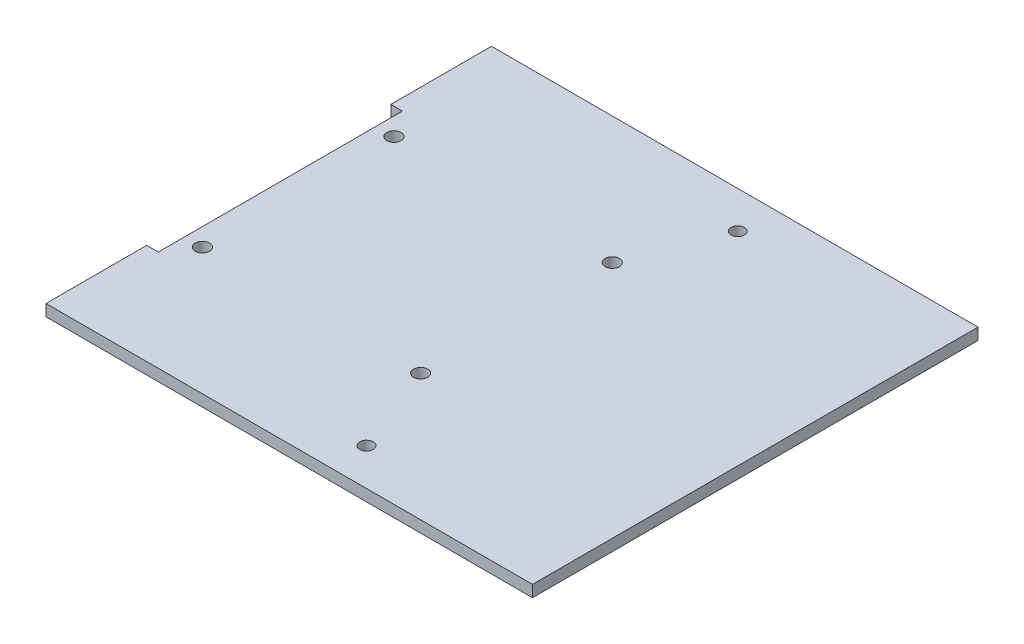
ISO-10303-21;
HEADER;
FILE_DESCRIPTION(('STEP AP214'),'2;1');
FILE_NAME('part.step','',(''),(''),'','','');
FILE_SCHEMA(('AUTOMOTIVE_DESIGN { 1 0 10303 214 1 1 1 1 }'));
ENDSEC;
DATA;
#1=APPLICATION_CONTEXT('core data for automotive mechanical design processes');
#2=APPLICATION_PROTOCOL_DEFINITION('international standard','automotive_design',2000,#1);
#3=PRODUCT_CONTEXT('',#1,'mechanical');
#4=PRODUCT('Part','Part','',(#3));
#5=PRODUCT_RELATED_PRODUCT_CATEGORY('part','',(#4));
#6=PRODUCT_DEFINITION_FORMATION('','',#4);
#7=PRODUCT_DEFINITION_CONTEXT('part definition',#1,'design');
#8=PRODUCT_DEFINITION('design','',#6,#7);
#9=PRODUCT_DEFINITION_SHAPE('','',#8);
#10=(LENGTH_UNIT() NAMED_UNIT(*) SI_UNIT(.MILLI.,.METRE.));
#11=(NAMED_UNIT(*) PLANE_ANGLE_UNIT() SI_UNIT($,.RADIAN.));
#12=(NAMED_UNIT(*) SI_UNIT($,.STERADIAN.) SOLID_ANGLE_UNIT());
#13=UNCERTAINTY_MEASURE_WITH_UNIT(LENGTH_MEASURE(1.E-05),#10,'distance_accuracy_value','');
#14=(GEOMETRIC_REPRESENTATION_CONTEXT(3) GLOBAL_UNCERTAINTY_ASSIGNED_CONTEXT((#13)) GLOBAL_UNIT_ASSIGNED_CONTEXT((#10,
#11,#12)) REPRESENTATION_CONTEXT('',''));
#15=CARTESIAN_POINT('',(0.,0.,0.));
#16=DIRECTION('',(0.,0.,1.));
#17=DIRECTION('',(1.,0.,0.));
#18=AXIS2_PLACEMENT_3D('',#15,#16,#17);
#19=CARTESIAN_POINT('',(54.6,0.,0.));
#20=DIRECTION('',(-1.,0.,0.));
#21=DIRECTION('',(0.,0.,1.));
#22=AXIS2_PLACEMENT_3D('',#19,#20,#21);
#23=PLANE('',#22);
#24=DIRECTION('',(0.,0.,-1.));
#25=VECTOR('',#24,1.);
#26=CARTESIAN_POINT('',(54.6,2.6,0.));
#27=LINE('',#26,#25);
#28=CARTESIAN_POINT('',(54.6,2.6,50.));
#29=VERTEX_POINT('',#28);
#30=CARTESIAN_POINT('',(54.6,2.6,-50.));
#31=VERTEX_POINT('',#30);
#32=EDGE_CURVE('E106',#29,#31,#27,.T.);
#33=ORIENTED_EDGE('',*,*,#32,.F.);
#34=DIRECTION('',(0.,-1.,0.));
#35=VECTOR('',#34,1.);
#36=CARTESIAN_POINT('',(54.6,0.,50.));
#37=LINE('',#36,#35);
#38=CARTESIAN_POINT('',(54.6,0.,50.));
#39=VERTEX_POINT('',#38);
#40=EDGE_CURVE('E118',#29,#39,#37,.T.);
#41=ORIENTED_EDGE('',*,*,#40,.T.);
#42=DIRECTION('',(0.,0.,-1.));
#43=VECTOR('',#42,1.);
#44=CARTESIAN_POINT('',(54.6,0.,50.));
#45=LINE('',#44,#43);
#46=CARTESIAN_POINT('',(54.6,0.,-50.));
#47=VERTEX_POINT('',#46);
#48=EDGE_CURVE('E126',#39,#47,#45,.T.);
#49=ORIENTED_EDGE('',*,*,#48,.T.);
#50=DIRECTION('',(0.,1.,0.));
#51=VECTOR('',#50,1.);
#52=CARTESIAN_POINT('',(54.6,0.,-50.));
#53=LINE('',#52,#51);
#54=EDGE_CURVE('E121',#47,#31,#53,.T.);
#55=ORIENTED_EDGE('',*,*,#54,.T.);
#56=EDGE_LOOP('',(#33,#41,#49,#55));
#57=FACE_BOUND('',#56,.T.);
#58=ADVANCED_FACE('F39',(#57),#23,.F.);
#59=CARTESIAN_POINT('',(0.,2.6,50.));
#60=DIRECTION('',(0.,0.,-1.));
#61=DIRECTION('',(-1.,0.,0.));
#62=AXIS2_PLACEMENT_3D('',#59,#60,#61);
#63=PLANE('',#62);
#64=DIRECTION('',(-1.,0.,0.));
#65=VECTOR('',#64,1.);
#66=CARTESIAN_POINT('',(-52.,2.6,50.));
#67=LINE('',#66,#65);
#68=CARTESIAN_POINT('',(-54.6,2.6,50.));
#69=VERTEX_POINT('',#68);
#70=EDGE_CURVE('E103',#29,#69,#67,.T.);
#71=ORIENTED_EDGE('',*,*,#70,.T.);
#72=DIRECTION('',(0.,1.,0.));
#73=VECTOR('',#72,1.);
#74=CARTESIAN_POINT('',(-54.6,0.,50.));
#75=LINE('',#74,#73);
#76=CARTESIAN_POINT('',(-54.6,0.,50.));
#77=VERTEX_POINT('',#76);
#78=EDGE_CURVE('E141',#77,#69,#75,.T.);
#79=ORIENTED_EDGE('',*,*,#78,.F.);
#80=DIRECTION('',(1.,0.,0.));
#81=VECTOR('',#80,1.);
#82=CARTESIAN_POINT('',(0.,0.,50.));
#83=LINE('',#82,#81);
#84=EDGE_CURVE('E113',#77,#39,#83,.T.);
#85=ORIENTED_EDGE('',*,*,#84,.T.);
#86=ORIENTED_EDGE('',*,*,#40,.F.);
#87=EDGE_LOOP('',(#71,#79,#85,#86));
#88=FACE_BOUND('',#87,.T.);
#89=ADVANCED_FACE('F41',(#88),#63,.F.);
#90=CARTESIAN_POINT('',(0.,2.6,-50.));
#91=DIRECTION('',(0.,0.,-1.));
#92=DIRECTION('',(-1.,0.,0.));
#93=AXIS2_PLACEMENT_3D('',#90,#91,#92);
#94=PLANE('',#93);
#95=DIRECTION('',(0.,-1.,0.));
#96=VECTOR('',#95,1.);
#97=CARTESIAN_POINT('',(-54.6,0.,-50.));
#98=LINE('',#97,#96);
#99=CARTESIAN_POINT('',(-54.6,2.6,-50.));
#100=VERTEX_POINT('',#99);
#101=CARTESIAN_POINT('',(-54.6,0.,-50.));
#102=VERTEX_POINT('',#101);
#103=EDGE_CURVE('E48',#100,#102,#98,.T.);
#104=ORIENTED_EDGE('',*,*,#103,.F.);
#105=DIRECTION('',(1.,0.,0.));
#106=VECTOR('',#105,1.);
#107=CARTESIAN_POINT('',(-52.,2.6,-50.));
#108=LINE('',#107,#106);
#109=EDGE_CURVE('E63',#100,#31,#108,.T.);
#110=ORIENTED_EDGE('',*,*,#109,.T.);
#111=ORIENTED_EDGE('',*,*,#54,.F.);
#112=DIRECTION('',(1.,0.,0.));
#113=VECTOR('',#112,1.);
#114=CARTESIAN_POINT('',(0.,0.,-50.));
#115=LINE('',#114,#113);
#116=EDGE_CURVE('E156',#102,#47,#115,.T.);
#117=ORIENTED_EDGE('',*,*,#116,.F.);
#118=EDGE_LOOP('',(#104,#110,#111,#117));
#119=FACE_BOUND('',#118,.T.);
#120=ADVANCED_FACE('F243',(#119),#94,.T.);
#121=CARTESIAN_POINT('',(0.,0.,-27.4));
#122=DIRECTION('',(0.,0.,-1.));
#123=DIRECTION('',(-1.,0.,0.));
#124=AXIS2_PLACEMENT_3D('',#121,#122,#123);
#125=PLANE('',#124);
#126=DIRECTION('',(1.,0.,0.));
#127=VECTOR('',#126,1.);
#128=CARTESIAN_POINT('',(0.,2.6,-27.4));
#129=LINE('',#128,#127);
#130=CARTESIAN_POINT('',(-54.6,2.6,-27.4));
#131=VERTEX_POINT('',#130);
#132=CARTESIAN_POINT('',(-52.,2.6,-27.4));
#133=VERTEX_POINT('',#132);
#134=EDGE_CURVE('E174',#131,#133,#129,.T.);
#135=ORIENTED_EDGE('',*,*,#134,.F.);
#136=DIRECTION('',(0.,-1.,0.));
#137=VECTOR('',#136,1.);
#138=CARTESIAN_POINT('',(-54.6,0.,-27.4));
#139=LINE('',#138,#137);
#140=CARTESIAN_POINT('',(-54.6,0.,-27.4));
#141=VERTEX_POINT('',#140);
#142=EDGE_CURVE('E168',#131,#141,#139,.T.);
#143=ORIENTED_EDGE('',*,*,#142,.T.);
#144=DIRECTION('',(-1.,0.,0.));
#145=VECTOR('',#144,1.);
#146=CARTESIAN_POINT('',(-52.,0.,-27.4));
#147=LINE('',#146,#145);
#148=CARTESIAN_POINT('',(-52.,0.,-27.4));
#149=VERTEX_POINT('',#148);
#150=EDGE_CURVE('E153',#149,#141,#147,.T.);
#151=ORIENTED_EDGE('',*,*,#150,.F.);
#152=DIRECTION('',(0.,1.,0.));
#153=VECTOR('',#152,1.);
#154=CARTESIAN_POINT('',(-52.,0.,-27.4));
#155=LINE('',#154,#153);
#156=EDGE_CURVE('E148',#149,#133,#155,.T.);
#157=ORIENTED_EDGE('',*,*,#156,.T.);
#158=EDGE_LOOP('',(#135,#143,#151,#157));
#159=FACE_BOUND('',#158,.T.);
#160=ADVANCED_FACE('F237',(#159),#125,.F.);
#161=CARTESIAN_POINT('',(0.,0.,27.4));
#162=DIRECTION('',(0.,0.,-1.));
#163=DIRECTION('',(-1.,0.,0.));
#164=AXIS2_PLACEMENT_3D('',#161,#162,#163);
#165=PLANE('',#164);
#166=DIRECTION('',(0.,-1.,0.));
#167=VECTOR('',#166,1.);
#168=CARTESIAN_POINT('',(-54.6,0.,27.4));
#169=LINE('',#168,#167);
#170=CARTESIAN_POINT('',(-54.6,2.6,27.4));
#171=VERTEX_POINT('',#170);
#172=CARTESIAN_POINT('',(-54.6,0.,27.4));
#173=VERTEX_POINT('',#172);
#174=EDGE_CURVE('E122',#171,#173,#169,.T.);
#175=ORIENTED_EDGE('',*,*,#174,.F.);
#176=DIRECTION('',(1.,0.,0.));
#177=VECTOR('',#176,1.);
#178=CARTESIAN_POINT('',(0.,2.6,27.4));
#179=LINE('',#178,#177);
#180=CARTESIAN_POINT('',(-52.,2.6,27.4));
#181=VERTEX_POINT('',#180);
#182=EDGE_CURVE('E56',#171,#181,#179,.T.);
#183=ORIENTED_EDGE('',*,*,#182,.T.);
#184=DIRECTION('',(0.,1.,0.));
#185=VECTOR('',#184,1.);
#186=CARTESIAN_POINT('',(-52.,24.,27.4));
#187=LINE('',#186,#185);
#188=CARTESIAN_POINT('',(-52.,0.,27.4));
#189=VERTEX_POINT('',#188);
#190=EDGE_CURVE('E11',#189,#181,#187,.T.);
#191=ORIENTED_EDGE('',*,*,#190,.F.);
#192=DIRECTION('',(1.,0.,0.));
#193=VECTOR('',#192,1.);
#194=CARTESIAN_POINT('',(-52.,0.,27.4));
#195=LINE('',#194,#193);
#196=EDGE_CURVE('E151',#173,#189,#195,.T.);
#197=ORIENTED_EDGE('',*,*,#196,.F.);
#198=EDGE_LOOP('',(#175,#183,#191,#197));
#199=FACE_BOUND('',#198,.T.);
#200=ADVANCED_FACE('F231',(#199),#165,.T.);
#201=CARTESIAN_POINT('',(-54.6,0.,0.));
#202=DIRECTION('',(1.,0.,0.));
#203=DIRECTION('',(0.,0.,-1.));
#204=AXIS2_PLACEMENT_3D('',#201,#202,#203);
#205=PLANE('',#204);
#206=DIRECTION('',(0.,0.,1.));
#207=VECTOR('',#206,1.);
#208=CARTESIAN_POINT('',(-54.6,2.6,0.));
#209=LINE('',#208,#207);
#210=EDGE_CURVE('E108',#171,#69,#209,.T.);
#211=ORIENTED_EDGE('',*,*,#210,.F.);
#212=ORIENTED_EDGE('',*,*,#174,.T.);
#213=DIRECTION('',(0.,0.,1.));
#214=VECTOR('',#213,1.);
#215=CARTESIAN_POINT('',(-54.6,0.,-50.));
#216=LINE('',#215,#214);
#217=EDGE_CURVE('E144',#173,#77,#216,.T.);
#218=ORIENTED_EDGE('',*,*,#217,.T.);
#219=ORIENTED_EDGE('',*,*,#78,.T.);
#220=EDGE_LOOP('',(#211,#212,#218,#219));
#221=FACE_BOUND('',#220,.T.);
#222=ADVANCED_FACE('F264',(#221),#205,.F.);
#223=DIRECTION('',(0.,0.,1.));
#224=VECTOR('',#223,1.);
#225=CARTESIAN_POINT('',(-54.6,2.6,0.));
#226=LINE('',#225,#224);
#227=EDGE_CURVE('E172',#100,#131,#226,.T.);
#228=ORIENTED_EDGE('',*,*,#227,.F.);
#229=ORIENTED_EDGE('',*,*,#103,.T.);
#230=EDGE_CURVE('E143',#102,#141,#216,.T.);
#231=ORIENTED_EDGE('',*,*,#230,.T.);
#232=ORIENTED_EDGE('',*,*,#142,.F.);
#233=EDGE_LOOP('',(#228,#229,#231,#232));
#234=FACE_BOUND('',#233,.T.);
#235=ADVANCED_FACE('F216',(#234),#205,.F.);
#236=CARTESIAN_POINT('',(0.,0.,0.));
#237=DIRECTION('',(0.,1.,0.));
#238=DIRECTION('',(0.,0.,1.));
#239=AXIS2_PLACEMENT_3D('',#236,#237,#238);
#240=PLANE('',#239);
#241=CARTESIAN_POINT('',(-48.,0.,-21.5));
#242=DIRECTION('',(0.,-1.,0.));
#243=DIRECTION('',(0.,0.,-1.));
#244=AXIS2_PLACEMENT_3D('',#241,#242,#243);
#245=CIRCLE('',#244,1.6);
#246=CARTESIAN_POINT('',(-48.,0.,-23.1));
#247=VERTEX_POINT('',#246);
#248=EDGE_CURVE('E191',#247,#247,#245,.T.);
#249=ORIENTED_EDGE('',*,*,#248,.F.);
#250=EDGE_LOOP('',(#249));
#251=FACE_BOUND('',#250,.T.);
#252=CARTESIAN_POINT('',(1.,0.,21.5));
#253=DIRECTION('',(0.,-1.,0.));
#254=DIRECTION('',(0.,0.,-1.));
#255=AXIS2_PLACEMENT_3D('',#252,#253,#254);
#256=CIRCLE('',#255,1.6);
#257=CARTESIAN_POINT('',(1.,0.,19.9));
#258=VERTEX_POINT('',#257);
#259=EDGE_CURVE('E184',#258,#258,#256,.T.);
#260=ORIENTED_EDGE('',*,*,#259,.F.);
#261=EDGE_LOOP('',(#260));
#262=FACE_BOUND('',#261,.T.);
#263=CARTESIAN_POINT('',(1.,0.,-21.5));
#264=DIRECTION('',(0.,-1.,0.));
#265=DIRECTION('',(0.,0.,-1.));
#266=AXIS2_PLACEMENT_3D('',#263,#264,#265);
#267=CIRCLE('',#266,1.6);
#268=CARTESIAN_POINT('',(1.,0.,-23.1));
#269=VERTEX_POINT('',#268);
#270=EDGE_CURVE('E196',#269,#269,#267,.T.);
#271=ORIENTED_EDGE('',*,*,#270,.F.);
#272=EDGE_LOOP('',(#271));
#273=FACE_BOUND('',#272,.T.);
#274=CARTESIAN_POINT('',(-48.,0.,21.5));
#275=DIRECTION('',(0.,-1.,0.));
#276=DIRECTION('',(0.,0.,-1.));
#277=AXIS2_PLACEMENT_3D('',#274,#275,#276);
#278=CIRCLE('',#277,1.6);
#279=CARTESIAN_POINT('',(-48.,0.,19.9));
#280=VERTEX_POINT('',#279);
#281=EDGE_CURVE('E178',#280,#280,#278,.T.);
#282=ORIENTED_EDGE('',*,*,#281,.F.);
#283=EDGE_LOOP('',(#282));
#284=FACE_BOUND('',#283,.T.);
#285=CARTESIAN_POINT('',(9.,0.,-41.672593915616));
#286=DIRECTION('',(0.,-1.,0.));
#287=DIRECTION('',(0.,0.,-1.));
#288=AXIS2_PLACEMENT_3D('',#285,#286,#287);
#289=CIRCLE('',#288,1.5);
#290=CARTESIAN_POINT('',(9.,0.,-43.172593915616));
#291=VERTEX_POINT('',#290);
#292=EDGE_CURVE('E159',#291,#291,#289,.T.);
#293=ORIENTED_EDGE('',*,*,#292,.F.);
#294=EDGE_LOOP('',(#293));
#295=FACE_BOUND('',#294,.T.);
#296=CARTESIAN_POINT('',(9.,0.,41.672593915616));
#297=DIRECTION('',(0.,-1.,0.));
#298=DIRECTION('',(0.,0.,1.));
#299=AXIS2_PLACEMENT_3D('',#296,#297,#298);
#300=CIRCLE('',#299,1.5);
#301=CARTESIAN_POINT('',(9.,0.,40.172593915616));
#302=VERTEX_POINT('',#301);
#303=EDGE_CURVE('E132',#302,#302,#300,.T.);
#304=ORIENTED_EDGE('',*,*,#303,.F.);
#305=EDGE_LOOP('',(#304));
#306=FACE_BOUND('',#305,.T.);
#307=ORIENTED_EDGE('',*,*,#217,.F.);
#308=ORIENTED_EDGE('',*,*,#196,.T.);
#309=DIRECTION('',(0.,0.,-1.));
#310=VECTOR('',#309,1.);
#311=CARTESIAN_POINT('',(-52.,0.,50.));
#312=LINE('',#311,#310);
#313=EDGE_CURVE('E136',#189,#149,#312,.T.);
#314=ORIENTED_EDGE('',*,*,#313,.T.);
#315=ORIENTED_EDGE('',*,*,#150,.T.);
#316=ORIENTED_EDGE('',*,*,#230,.F.);
#317=ORIENTED_EDGE('',*,*,#116,.T.);
#318=ORIENTED_EDGE('',*,*,#48,.F.);
#319=ORIENTED_EDGE('',*,*,#84,.F.);
#320=EDGE_LOOP('',(#307,#308,#314,#315,#316,#317,#318,#319));
#321=FACE_BOUND('',#320,.T.);
#322=ADVANCED_FACE('F212',(#251,#262,#273,#284,#295,#306,#321),#240,.F.);
#323=CARTESIAN_POINT('',(-52.,2.6,50.));
#324=DIRECTION('',(-1.,0.,0.));
#325=DIRECTION('',(0.,0.,1.));
#326=AXIS2_PLACEMENT_3D('',#323,#324,#325);
#327=PLANE('',#326);
#328=ORIENTED_EDGE('',*,*,#156,.F.);
#329=ORIENTED_EDGE('',*,*,#313,.F.);
#330=ORIENTED_EDGE('',*,*,#190,.T.);
#331=DIRECTION('',(0.,0.,-1.));
#332=VECTOR('',#331,1.);
#333=CARTESIAN_POINT('',(-52.,2.6,50.));
#334=LINE('',#333,#332);
#335=EDGE_CURVE('E114',#181,#133,#334,.T.);
#336=ORIENTED_EDGE('',*,*,#335,.T.);
#337=EDGE_LOOP('',(#328,#329,#330,#336));
#338=FACE_BOUND('',#337,.T.);
#339=ADVANCED_FACE('F215',(#338),#327,.T.);
#340=CARTESIAN_POINT('',(0.,2.6,0.));
#341=DIRECTION('',(0.,-1.,0.));
#342=DIRECTION('',(0.,0.,-1.));
#343=AXIS2_PLACEMENT_3D('',#340,#341,#342);
#344=PLANE('',#343);
#345=CARTESIAN_POINT('',(-48.,2.6,-21.5));
#346=DIRECTION('',(0.,-1.,0.));
#347=DIRECTION('',(0.,0.,-1.));
#348=AXIS2_PLACEMENT_3D('',#345,#346,#347);
#349=CIRCLE('',#348,1.6);
#350=CARTESIAN_POINT('',(-48.,2.6,-23.1));
#351=VERTEX_POINT('',#350);
#352=EDGE_CURVE('E181',#351,#351,#349,.T.);
#353=ORIENTED_EDGE('',*,*,#352,.T.);
#354=EDGE_LOOP('',(#353));
#355=FACE_BOUND('',#354,.T.);
#356=CARTESIAN_POINT('',(1.,2.6,21.5));
#357=DIRECTION('',(0.,-1.,0.));
#358=DIRECTION('',(0.,0.,-1.));
#359=AXIS2_PLACEMENT_3D('',#356,#357,#358);
#360=CIRCLE('',#359,1.6);
#361=CARTESIAN_POINT('',(1.,2.6,19.9));
#362=VERTEX_POINT('',#361);
#363=EDGE_CURVE('E187',#362,#362,#360,.T.);
#364=ORIENTED_EDGE('',*,*,#363,.T.);
#365=EDGE_LOOP('',(#364));
#366=FACE_BOUND('',#365,.T.);
#367=CARTESIAN_POINT('',(1.,2.6,-21.5));
#368=DIRECTION('',(0.,-1.,0.));
#369=DIRECTION('',(0.,0.,-1.));
#370=AXIS2_PLACEMENT_3D('',#367,#368,#369);
#371=CIRCLE('',#370,1.6);
#372=CARTESIAN_POINT('',(1.,2.6,-23.1));
#373=VERTEX_POINT('',#372);
#374=EDGE_CURVE('E188',#373,#373,#371,.T.);
#375=ORIENTED_EDGE('',*,*,#374,.T.);
#376=EDGE_LOOP('',(#375));
#377=FACE_BOUND('',#376,.T.);
#378=CARTESIAN_POINT('',(-48.,2.6,21.5));
#379=DIRECTION('',(0.,-1.,0.));
#380=DIRECTION('',(0.,0.,-1.));
#381=AXIS2_PLACEMENT_3D('',#378,#379,#380);
#382=CIRCLE('',#381,1.6);
#383=CARTESIAN_POINT('',(-48.,2.6,19.9));
#384=VERTEX_POINT('',#383);
#385=EDGE_CURVE('E177',#384,#384,#382,.T.);
#386=ORIENTED_EDGE('',*,*,#385,.T.);
#387=EDGE_LOOP('',(#386));
#388=FACE_BOUND('',#387,.T.);
#389=CARTESIAN_POINT('',(9.,2.6,-41.672593915616));
#390=DIRECTION('',(0.,-1.,0.));
#391=DIRECTION('',(0.,0.,-1.));
#392=AXIS2_PLACEMENT_3D('',#389,#390,#391);
#393=CIRCLE('',#392,1.5);
#394=CARTESIAN_POINT('',(9.,2.6,-43.172593915616));
#395=VERTEX_POINT('',#394);
#396=EDGE_CURVE('E43',#395,#395,#393,.T.);
#397=ORIENTED_EDGE('',*,*,#396,.T.);
#398=EDGE_LOOP('',(#397));
#399=FACE_BOUND('',#398,.T.);
#400=CARTESIAN_POINT('',(9.,2.6,41.672593915616));
#401=DIRECTION('',(0.,-1.,0.));
#402=DIRECTION('',(0.,0.,-1.));
#403=AXIS2_PLACEMENT_3D('',#400,#401,#402);
#404=CIRCLE('',#403,1.5);
#405=CARTESIAN_POINT('',(9.,2.6,40.172593915616));
#406=VERTEX_POINT('',#405);
#407=EDGE_CURVE('E130',#406,#406,#404,.T.);
#408=ORIENTED_EDGE('',*,*,#407,.T.);
#409=EDGE_LOOP('',(#408));
#410=FACE_BOUND('',#409,.T.);
#411=ORIENTED_EDGE('',*,*,#335,.F.);
#412=ORIENTED_EDGE('',*,*,#182,.F.);
#413=ORIENTED_EDGE('',*,*,#210,.T.);
#414=ORIENTED_EDGE('',*,*,#70,.F.);
#415=ORIENTED_EDGE('',*,*,#32,.T.);
#416=ORIENTED_EDGE('',*,*,#109,.F.);
#417=ORIENTED_EDGE('',*,*,#227,.T.);
#418=ORIENTED_EDGE('',*,*,#134,.T.);
#419=EDGE_LOOP('',(#411,#412,#413,#414,#415,#416,#417,#418));
#420=FACE_BOUND('',#419,.T.);
#421=ADVANCED_FACE('F105',(#355,#366,#377,#388,#399,#410,#420),#344,.F.);
#422=CARTESIAN_POINT('',(9.,30.8426406871193,41.672593915616));
#423=DIRECTION('',(0.,-1.,0.));
#424=DIRECTION('',(0.,0.,-1.));
#425=AXIS2_PLACEMENT_3D('',#422,#423,#424);
#426=CYLINDRICAL_SURFACE('',#425,1.5);
#427=CARTESIAN_POINT('',(9.,0.,40.172593915616));
#428=CARTESIAN_POINT('',(9.,0.0270833333333373,40.172593915616));
#429=CARTESIAN_POINT('',(9.,0.0541666666666711,40.172593915616));
#430=CARTESIAN_POINT('',(9.,0.108333333333338,40.172593915616));
#431=CARTESIAN_POINT('',(9.,0.13541666666667,40.172593915616));
#432=CARTESIAN_POINT('',(9.,0.189583333333337,40.172593915616));
#433=CARTESIAN_POINT('',(9.,0.216666666666671,40.172593915616));
#434=CARTESIAN_POINT('',(9.,0.270833333333337,40.172593915616));
#435=CARTESIAN_POINT('',(9.,0.29791666666667,40.172593915616));
#436=CARTESIAN_POINT('',(9.,0.352083333333336,40.172593915616));
#437=CARTESIAN_POINT('',(9.,0.37916666666667,40.172593915616));
#438=CARTESIAN_POINT('',(9.,0.433333333333337,40.172593915616));
#439=CARTESIAN_POINT('',(9.,0.460416666666669,40.172593915616));
#440=CARTESIAN_POINT('',(9.,0.514583333333336,40.172593915616));
#441=CARTESIAN_POINT('',(9.,0.541666666666669,40.172593915616));
#442=CARTESIAN_POINT('',(9.,0.595833333333336,40.172593915616));
#443=CARTESIAN_POINT('',(9.,0.622916666666669,40.172593915616));
#444=CARTESIAN_POINT('',(9.,0.677083333333335,40.172593915616));
#445=CARTESIAN_POINT('',(9.,0.704166666666669,40.172593915616));
#446=CARTESIAN_POINT('',(9.,0.758333333333337,40.172593915616));
#447=CARTESIAN_POINT('',(9.,0.78541666666667,40.172593915616));
#448=CARTESIAN_POINT('',(9.,0.839583333333337,40.172593915616));
#449=CARTESIAN_POINT('',(9.,0.86666666666667,40.172593915616));
#450=CARTESIAN_POINT('',(9.,0.920833333333336,40.172593915616));
#451=CARTESIAN_POINT('',(9.,0.94791666666667,40.172593915616));
#452=CARTESIAN_POINT('',(9.,1.00208333333334,40.172593915616));
#453=CARTESIAN_POINT('',(9.,1.02916666666667,40.172593915616));
#454=CARTESIAN_POINT('',(9.,1.08333333333334,40.172593915616));
#455=CARTESIAN_POINT('',(9.,1.11041666666667,40.172593915616));
#456=CARTESIAN_POINT('',(9.,1.16458333333334,40.172593915616));
#457=CARTESIAN_POINT('',(9.,1.19166666666667,40.172593915616));
#458=CARTESIAN_POINT('',(9.,1.24583333333333,40.172593915616));
#459=CARTESIAN_POINT('',(9.,1.27291666666667,40.172593915616));
#460=CARTESIAN_POINT('',(9.,1.32708333333334,40.172593915616));
#461=CARTESIAN_POINT('',(9.,1.35416666666667,40.172593915616));
#462=CARTESIAN_POINT('',(9.,1.40833333333334,40.172593915616));
#463=CARTESIAN_POINT('',(9.,1.43541666666667,40.172593915616));
#464=CARTESIAN_POINT('',(9.,1.48958333333334,40.172593915616));
#465=CARTESIAN_POINT('',(9.,1.51666666666667,40.172593915616));
#466=CARTESIAN_POINT('',(9.,1.57083333333334,40.172593915616));
#467=CARTESIAN_POINT('',(9.,1.59791666666667,40.172593915616));
#468=CARTESIAN_POINT('',(9.,1.65208333333334,40.172593915616));
#469=CARTESIAN_POINT('',(9.,1.67916666666667,40.172593915616));
#470=CARTESIAN_POINT('',(9.,1.73333333333334,40.172593915616));
#471=CARTESIAN_POINT('',(9.,1.76041666666667,40.172593915616));
#472=CARTESIAN_POINT('',(9.,1.81458333333333,40.172593915616));
#473=CARTESIAN_POINT('',(9.,1.84166666666667,40.172593915616));
#474=CARTESIAN_POINT('',(9.,1.89583333333334,40.172593915616));
#475=CARTESIAN_POINT('',(9.,1.92291666666667,40.172593915616));
#476=CARTESIAN_POINT('',(9.,1.97708333333334,40.172593915616));
#477=CARTESIAN_POINT('',(9.,2.00416666666667,40.172593915616));
#478=CARTESIAN_POINT('',(9.,2.05833333333334,40.172593915616));
#479=CARTESIAN_POINT('',(9.,2.08541666666667,40.172593915616));
#480=CARTESIAN_POINT('',(9.,2.13958333333334,40.172593915616));
#481=CARTESIAN_POINT('',(9.,2.16666666666667,40.172593915616));
#482=CARTESIAN_POINT('',(9.,2.22083333333333,40.172593915616));
#483=CARTESIAN_POINT('',(9.,2.24791666666667,40.172593915616));
#484=CARTESIAN_POINT('',(9.,2.30208333333334,40.172593915616));
#485=CARTESIAN_POINT('',(9.,2.32916666666667,40.172593915616));
#486=CARTESIAN_POINT('',(9.,2.38333333333333,40.172593915616));
#487=CARTESIAN_POINT('',(9.,2.41041666666667,40.172593915616));
#488=CARTESIAN_POINT('',(9.,2.46458333333334,40.172593915616));
#489=CARTESIAN_POINT('',(9.,2.49166666666667,40.172593915616));
#490=CARTESIAN_POINT('',(9.,2.54583333333334,40.172593915616));
#491=CARTESIAN_POINT('',(9.,2.57291666666667,40.172593915616));
#492=CARTESIAN_POINT('',(9.,2.6,40.172593915616));
#493=B_SPLINE_CURVE_WITH_KNOTS('',3,(#427,#428,#429,#430,#431,#432,#433,#434,#435,#436,#437,
#438,#439,#440,#441,#442,#443,#444,#445,#446,#447,#448,#449,#450,#451,#452,#453,#454,#455,#456,
#457,#458,#459,#460,#461,#462,#463,#464,#465,#466,#467,#468,#469,#470,#471,#472,#473,#474,#475,
#476,#477,#478,#479,#480,#481,#482,#483,#484,#485,#486,#487,#488,#489,#490,#491,#492),
.UNSPECIFIED.,.F.,.F.,(4,2,2,2,2,2,2,2,2,2,2,2,2,2,2,2,2,2,2,2,2,2,2,2,2,2,2,2,2,2,2,2,4),(0.,
0.0812500000000015,0.162499999999999,0.243750000000001,0.324999999999999,0.40625,
0.487499999999998,0.56875,0.649999999999998,0.731249999999999,0.812500000000001,
0.893749999999999,0.975,1.05625,1.1375,1.21875,1.3,1.38125,1.4625,1.54375,1.625,1.70625,1.7875,
1.86875,1.95,2.03125,2.1125,2.19375,2.275,2.35625,2.4375,2.51875,2.6),.UNSPECIFIED.);
#494=EDGE_CURVE('BSEAM257',#302,#406,#493,.T.);
#495=ORIENTED_EDGE('',*,*,#303,.T.);
#496=ORIENTED_EDGE('',*,*,#407,.F.);
#497=ORIENTED_EDGE('',*,*,#494,.T.);
#498=ORIENTED_EDGE('',*,*,#494,.F.);
#499=EDGE_LOOP('',(#495,#497,#496,#498));
#500=FACE_BOUND('',#499,.T.);
#501=ADVANCED_FACE('F257',(#500),#426,.F.);
#502=CARTESIAN_POINT('',(9.,30.8426406871193,-41.672593915616));
#503=DIRECTION('',(0.,-1.,0.));
#504=DIRECTION('',(0.,0.,-1.));
#505=AXIS2_PLACEMENT_3D('',#502,#503,#504);
#506=CYLINDRICAL_SURFACE('',#505,1.5);
#507=CARTESIAN_POINT('',(9.,0.,-43.172593915616));
#508=CARTESIAN_POINT('',(9.,0.0270833333333373,-43.172593915616));
#509=CARTESIAN_POINT('',(9.,0.0541666666666711,-43.172593915616));
#510=CARTESIAN_POINT('',(9.,0.108333333333338,-43.172593915616));
#511=CARTESIAN_POINT('',(9.,0.13541666666667,-43.172593915616));
#512=CARTESIAN_POINT('',(9.,0.189583333333337,-43.172593915616));
#513=CARTESIAN_POINT('',(9.,0.216666666666671,-43.172593915616));
#514=CARTESIAN_POINT('',(9.,0.270833333333337,-43.172593915616));
#515=CARTESIAN_POINT('',(9.,0.29791666666667,-43.172593915616));
#516=CARTESIAN_POINT('',(9.,0.352083333333336,-43.172593915616));
#517=CARTESIAN_POINT('',(9.,0.37916666666667,-43.172593915616));
#518=CARTESIAN_POINT('',(9.,0.433333333333337,-43.172593915616));
#519=CARTESIAN_POINT('',(9.,0.460416666666669,-43.172593915616));
#520=CARTESIAN_POINT('',(9.,0.514583333333336,-43.172593915616));
#521=CARTESIAN_POINT('',(9.,0.541666666666669,-43.172593915616));
#522=CARTESIAN_POINT('',(9.,0.595833333333336,-43.172593915616));
#523=CARTESIAN_POINT('',(9.,0.622916666666669,-43.172593915616));
#524=CARTESIAN_POINT('',(9.,0.677083333333335,-43.172593915616));
#525=CARTESIAN_POINT('',(9.,0.704166666666669,-43.172593915616));
#526=CARTESIAN_POINT('',(9.,0.758333333333337,-43.172593915616));
#527=CARTESIAN_POINT('',(9.,0.78541666666667,-43.172593915616));
#528=CARTESIAN_POINT('',(9.,0.839583333333337,-43.172593915616));
#529=CARTESIAN_POINT('',(9.,0.86666666666667,-43.172593915616));
#530=CARTESIAN_POINT('',(9.,0.920833333333336,-43.172593915616));
#531=CARTESIAN_POINT('',(9.,0.94791666666667,-43.172593915616));
#532=CARTESIAN_POINT('',(9.,1.00208333333334,-43.172593915616));
#533=CARTESIAN_POINT('',(9.,1.02916666666667,-43.172593915616));
#534=CARTESIAN_POINT('',(9.,1.08333333333334,-43.172593915616));
#535=CARTESIAN_POINT('',(9.,1.11041666666667,-43.172593915616));
#536=CARTESIAN_POINT('',(9.,1.16458333333334,-43.172593915616));
#537=CARTESIAN_POINT('',(9.,1.19166666666667,-43.172593915616));
#538=CARTESIAN_POINT('',(9.,1.24583333333333,-43.172593915616));
#539=CARTESIAN_POINT('',(9.,1.27291666666667,-43.172593915616));
#540=CARTESIAN_POINT('',(9.,1.32708333333334,-43.172593915616));
#541=CARTESIAN_POINT('',(9.,1.35416666666667,-43.172593915616));
#542=CARTESIAN_POINT('',(9.,1.40833333333334,-43.172593915616));
#543=CARTESIAN_POINT('',(9.,1.43541666666667,-43.172593915616));
#544=CARTESIAN_POINT('',(9.,1.48958333333334,-43.172593915616));
#545=CARTESIAN_POINT('',(9.,1.51666666666667,-43.172593915616));
#546=CARTESIAN_POINT('',(9.,1.57083333333334,-43.172593915616));
#547=CARTESIAN_POINT('',(9.,1.59791666666667,-43.172593915616));
#548=CARTESIAN_POINT('',(9.,1.65208333333334,-43.172593915616));
#549=CARTESIAN_POINT('',(9.,1.67916666666667,-43.172593915616));
#550=CARTESIAN_POINT('',(9.,1.73333333333334,-43.172593915616));
#551=CARTESIAN_POINT('',(9.,1.76041666666667,-43.172593915616));
#552=CARTESIAN_POINT('',(9.,1.81458333333333,-43.172593915616));
#553=CARTESIAN_POINT('',(9.,1.84166666666667,-43.172593915616));
#554=CARTESIAN_POINT('',(9.,1.89583333333334,-43.172593915616));
#555=CARTESIAN_POINT('',(9.,1.92291666666667,-43.172593915616));
#556=CARTESIAN_POINT('',(9.,1.97708333333334,-43.172593915616));
#557=CARTESIAN_POINT('',(9.,2.00416666666667,-43.172593915616));
#558=CARTESIAN_POINT('',(9.,2.05833333333334,-43.172593915616));
#559=CARTESIAN_POINT('',(9.,2.08541666666667,-43.172593915616));
#560=CARTESIAN_POINT('',(9.,2.13958333333334,-43.172593915616));
#561=CARTESIAN_POINT('',(9.,2.16666666666667,-43.172593915616));
#562=CARTESIAN_POINT('',(9.,2.22083333333333,-43.172593915616));
#563=CARTESIAN_POINT('',(9.,2.24791666666667,-43.172593915616));
#564=CARTESIAN_POINT('',(9.,2.30208333333334,-43.172593915616));
#565=CARTESIAN_POINT('',(9.,2.32916666666667,-43.172593915616));
#566=CARTESIAN_POINT('',(9.,2.38333333333333,-43.172593915616));
#567=CARTESIAN_POINT('',(9.,2.41041666666667,-43.172593915616));
#568=CARTESIAN_POINT('',(9.,2.46458333333334,-43.172593915616));
#569=CARTESIAN_POINT('',(9.,2.49166666666667,-43.172593915616));
#570=CARTESIAN_POINT('',(9.,2.54583333333334,-43.172593915616));
#571=CARTESIAN_POINT('',(9.,2.57291666666667,-43.172593915616));
#572=CARTESIAN_POINT('',(9.,2.6,-43.172593915616));
#573=B_SPLINE_CURVE_WITH_KNOTS('',3,(#507,#508,#509,#510,#511,#512,#513,#514,#515,#516,#517,
#518,#519,#520,#521,#522,#523,#524,#525,#526,#527,#528,#529,#530,#531,#532,#533,#534,#535,#536,
#537,#538,#539,#540,#541,#542,#543,#544,#545,#546,#547,#548,#549,#550,#551,#552,#553,#554,#555,
#556,#557,#558,#559,#560,#561,#562,#563,#564,#565,#566,#567,#568,#569,#570,#571,#572),
.UNSPECIFIED.,.F.,.F.,(4,2,2,2,2,2,2,2,2,2,2,2,2,2,2,2,2,2,2,2,2,2,2,2,2,2,2,2,2,2,2,2,4),(0.,
0.0812500000000015,0.162499999999999,0.243750000000001,0.324999999999999,0.40625,
0.487499999999998,0.56875,0.649999999999998,0.731249999999999,0.812500000000001,
0.893749999999999,0.975,1.05625,1.1375,1.21875,1.3,1.38125,1.4625,1.54375,1.625,1.70625,1.7875,
1.86875,1.95,2.03125,2.1125,2.19375,2.275,2.35625,2.4375,2.51875,2.6),.UNSPECIFIED.);
#574=EDGE_CURVE('BSEAM303',#291,#395,#573,.T.);
#575=ORIENTED_EDGE('',*,*,#292,.T.);
#576=ORIENTED_EDGE('',*,*,#396,.F.);
#577=ORIENTED_EDGE('',*,*,#574,.T.);
#578=ORIENTED_EDGE('',*,*,#574,.F.);
#579=EDGE_LOOP('',(#575,#577,#576,#578));
#580=FACE_BOUND('',#579,.T.);
#581=ADVANCED_FACE('F303',(#580),#506,.F.);
#582=CARTESIAN_POINT('',(-48.,2.6,21.5));
#583=DIRECTION('',(0.,-1.,0.));
#584=DIRECTION('',(0.,0.,-1.));
#585=AXIS2_PLACEMENT_3D('',#582,#583,#584);
#586=CYLINDRICAL_SURFACE('',#585,1.6);
#587=ORIENTED_EDGE('',*,*,#385,.F.);
#588=EDGE_LOOP('',(#587));
#589=FACE_BOUND('',#588,.T.);
#590=ORIENTED_EDGE('',*,*,#281,.T.);
#591=EDGE_LOOP('',(#590));
#592=FACE_BOUND('',#591,.T.);
#593=ADVANCED_FACE('F208',(#589,#592),#586,.F.);
#594=CARTESIAN_POINT('',(1.,2.6,-21.5));
#595=DIRECTION('',(0.,-1.,0.));
#596=DIRECTION('',(0.,0.,-1.));
#597=AXIS2_PLACEMENT_3D('',#594,#595,#596);
#598=CYLINDRICAL_SURFACE('',#597,1.6);
#599=ORIENTED_EDGE('',*,*,#374,.F.);
#600=EDGE_LOOP('',(#599));
#601=FACE_BOUND('',#600,.T.);
#602=ORIENTED_EDGE('',*,*,#270,.T.);
#603=EDGE_LOOP('',(#602));
#604=FACE_BOUND('',#603,.T.);
#605=ADVANCED_FACE('F204',(#601,#604),#598,.F.);
#606=CARTESIAN_POINT('',(1.,2.6,21.5));
#607=DIRECTION('',(0.,-1.,0.));
#608=DIRECTION('',(0.,0.,-1.));
#609=AXIS2_PLACEMENT_3D('',#606,#607,#608);
#610=CYLINDRICAL_SURFACE('',#609,1.6);
#611=ORIENTED_EDGE('',*,*,#363,.F.);
#612=EDGE_LOOP('',(#611));
#613=FACE_BOUND('',#612,.T.);
#614=ORIENTED_EDGE('',*,*,#259,.T.);
#615=EDGE_LOOP('',(#614));
#616=FACE_BOUND('',#615,.T.);
#617=ADVANCED_FACE('F207',(#613,#616),#610,.F.);
#618=CARTESIAN_POINT('',(-48.,2.6,-21.5));
#619=DIRECTION('',(0.,-1.,0.));
#620=DIRECTION('',(0.,0.,-1.));
#621=AXIS2_PLACEMENT_3D('',#618,#619,#620);
#622=CYLINDRICAL_SURFACE('',#621,1.6);
#623=ORIENTED_EDGE('',*,*,#352,.F.);
#624=EDGE_LOOP('',(#623));
#625=FACE_BOUND('',#624,.T.);
#626=ORIENTED_EDGE('',*,*,#248,.T.);
#627=EDGE_LOOP('',(#626));
#628=FACE_BOUND('',#627,.T.);
#629=ADVANCED_FACE('F320',(#625,#628),#622,.F.);
#630=CLOSED_SHELL('',(#58,#89,#120,#160,#200,#222,#235,#322,#339,#421,#501,#581,#593,#605,#617,#629));
#631=MANIFOLD_SOLID_BREP('B2',#630);
#632=ADVANCED_BREP_SHAPE_REPRESENTATION('',(#18,#631),#14);
#633=SHAPE_DEFINITION_REPRESENTATION(#9,#632);
ENDSEC;
END-ISO-10303-21;
